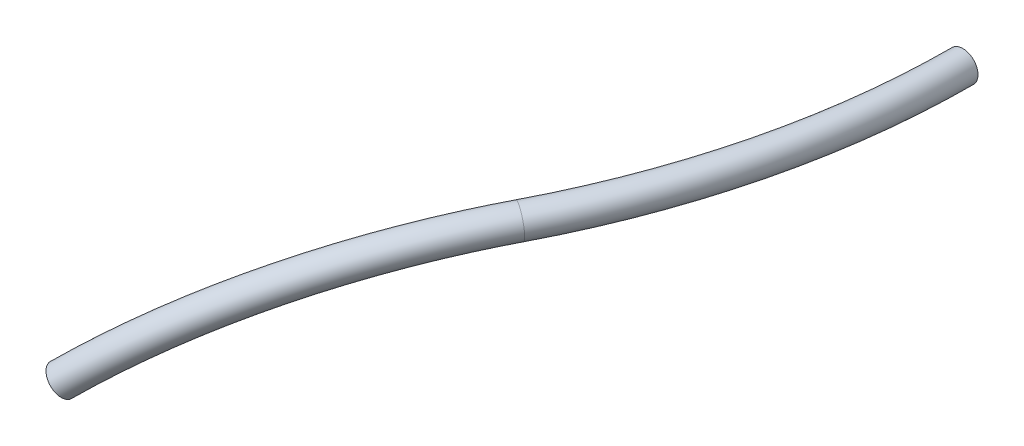
ISO-10303-21;
HEADER;
FILE_DESCRIPTION(('STEP AP214'),'2;1');
FILE_NAME('part.step','',(''),(''),'','','');
FILE_SCHEMA(('AUTOMOTIVE_DESIGN { 1 0 10303 214 1 1 1 1 }'));
ENDSEC;
DATA;
#1=APPLICATION_CONTEXT('core data for automotive mechanical design processes');
#2=APPLICATION_PROTOCOL_DEFINITION('international standard','automotive_design',2000,#1);
#3=PRODUCT_CONTEXT('',#1,'mechanical');
#4=PRODUCT('Part','Part','',(#3));
#5=PRODUCT_RELATED_PRODUCT_CATEGORY('part','',(#4));
#6=PRODUCT_DEFINITION_FORMATION('','',#4);
#7=PRODUCT_DEFINITION_CONTEXT('part definition',#1,'design');
#8=PRODUCT_DEFINITION('design','',#6,#7);
#9=PRODUCT_DEFINITION_SHAPE('','',#8);
#10=(LENGTH_UNIT() NAMED_UNIT(*) SI_UNIT(.MILLI.,.METRE.));
#11=(NAMED_UNIT(*) PLANE_ANGLE_UNIT() SI_UNIT($,.RADIAN.));
#12=(NAMED_UNIT(*) SI_UNIT($,.STERADIAN.) SOLID_ANGLE_UNIT());
#13=UNCERTAINTY_MEASURE_WITH_UNIT(LENGTH_MEASURE(1.E-05),#10,'distance_accuracy_value','');
#14=(GEOMETRIC_REPRESENTATION_CONTEXT(3) GLOBAL_UNCERTAINTY_ASSIGNED_CONTEXT((#13)) GLOBAL_UNIT_ASSIGNED_CONTEXT((#10,
#11,#12)) REPRESENTATION_CONTEXT('',''));
#15=CARTESIAN_POINT('',(0.,0.,0.));
#16=DIRECTION('',(0.,0.,1.));
#17=DIRECTION('',(1.,0.,0.));
#18=AXIS2_PLACEMENT_3D('',#15,#16,#17);
#19=CARTESIAN_POINT('',(1449.22687603527,6635.02328484005,-2.11547757089647E-06));
#20=DIRECTION('',(-0.119729229192261,0.992806583215999,-4.32585094379392E-10));
#21=DIRECTION('',(-0.992806583215999,-0.119729229192262,0.));
#22=AXIS2_PLACEMENT_3D('',#19,#20,#21);
#23=TOROIDAL_SURFACE('',#22,2149.78602138148,50.7999999999995);
#24=CARTESIAN_POINT('',(3249.41686541766,6852.12031458555,1154.88736015426));
#25=DIRECTION('',(-0.533345999528203,-0.0643197845013856,0.843448285379108));
#26=DIRECTION('',(0.845692468035311,-0.0186089838064212,0.53334599954442));
#27=AXIS2_PLACEMENT_3D('',#24,#25,#26);
#28=CIRCLE('',#27,50.7999999999995);
#29=CARTESIAN_POINT('',(3291.95582071417,6857.25037357811,1182.17764738276));
#30=VERTEX_POINT('',#29);
#31=EDGE_CURVE('E10',#30,#30,#28,.T.);
#32=CARTESIAN_POINT('',(3583.54859056854,6892.41550810836,0.));
#33=DIRECTION('',(0.,0.,1.));
#34=DIRECTION('',(1.,0.,0.));
#35=AXIS2_PLACEMENT_3D('',#32,#33,#34);
#36=CIRCLE('',#35,50.7999999999995);
#37=CARTESIAN_POINT('',(3633.98316499591,6898.49775295132,4.99892824368086E-08));
#38=VERTEX_POINT('',#37);
#39=EDGE_CURVE('E41',#38,#38,#36,.T.);
#40=CARTESIAN_POINT('',(1449.22687603527,6635.02328484005,-2.11547757089647E-06));
#41=DIRECTION('',(-0.119729229192261,0.992806583215999,-4.32585094379392E-10));
#42=DIRECTION('',(-0.992806583215999,-0.119729229192262,0.));
#43=AXIS2_PLACEMENT_3D('',#40,#41,#42);
#44=CIRCLE('',#43,2200.58602138148);
#45=EDGE_CURVE('',#30,#38,#44,.T.);
#46=ORIENTED_EDGE('',*,*,#31,.F.);
#47=ORIENTED_EDGE('',*,*,#39,.T.);
#48=ORIENTED_EDGE('',*,*,#45,.T.);
#49=ORIENTED_EDGE('',*,*,#45,.F.);
#50=EDGE_LOOP('',(#46,#48,#47,#49));
#51=FACE_BOUND('',#50,.T.);
#52=ADVANCED_FACE('F35',(#51),#23,.T.);
#53=CARTESIAN_POINT('',(3583.54859056854,6892.41550810836,0.));
#54=DIRECTION('',(0.,0.,1.));
#55=DIRECTION('',(1.,0.,0.));
#56=AXIS2_PLACEMENT_3D('',#53,#54,#55);
#57=PLANE('',#56);
#58=ORIENTED_EDGE('',*,*,#39,.F.);
#59=EDGE_LOOP('',(#58));
#60=FACE_BOUND('',#59,.T.);
#61=ADVANCED_FACE('F56',(#60),#57,.F.);
#62=CARTESIAN_POINT('',(2626.00109106416,5569.72824654101,662.883879267917));
#63=DIRECTION('',(-0.73805584036661,0.5225614180308,-0.426852598547059));
#64=DIRECTION('',(-0.577849341156667,-0.81614345486857,0.));
#65=AXIS2_PLACEMENT_3D('',#62,#63,#64);
#66=TOROIDAL_SURFACE('',#65,1508.39121884895,50.8000000000123);
#67=CARTESIAN_POINT('',(2474.89287595592,6385.37870393067,1922.69525712868));
#68=DIRECTION('',(-0.667261466786293,-0.65918713022834,0.346748413527057));
#69=DIRECTION('',(0.576318448675826,-0.162031732047553,0.801001100826684));
#70=AXIS2_PLACEMENT_3D('',#67,#68,#69);
#71=CIRCLE('',#70,50.8000000000123);
#72=CARTESIAN_POINT('',(2504.16985314866,6377.14749194265,1963.38611305069));
#73=VERTEX_POINT('',#72);
#74=EDGE_CURVE('E45',#73,#73,#71,.T.);
#75=ORIENTED_EDGE('',*,*,#74,.F.);
#76=EDGE_LOOP('',(#75));
#77=FACE_BOUND('',#76,.T.);
#78=ORIENTED_EDGE('',*,*,#31,.T.);
#79=EDGE_LOOP('',(#78));
#80=FACE_BOUND('',#79,.T.);
#81=ADVANCED_FACE('F54',(#77,#80),#66,.T.);
#82=CARTESIAN_POINT('',(2474.89287595592,6385.37870393067,1922.69525712868));
#83=DIRECTION('',(-0.667261466786293,-0.65918713022834,0.346748413527057));
#84=DIRECTION('',(0.576318448675826,-0.162031732047553,0.801001100826684));
#85=AXIS2_PLACEMENT_3D('',#82,#83,#84);
#86=PLANE('',#85);
#87=ORIENTED_EDGE('',*,*,#74,.T.);
#88=EDGE_LOOP('',(#87));
#89=FACE_BOUND('',#88,.T.);
#90=ADVANCED_FACE('F52',(#89),#86,.T.);
#91=CLOSED_SHELL('',(#52,#61,#81,#90));
#92=MANIFOLD_SOLID_BREP('B2',#91);
#93=ADVANCED_BREP_SHAPE_REPRESENTATION('',(#18,#92),#14);
#94=SHAPE_DEFINITION_REPRESENTATION(#9,#93);
ENDSEC;
END-ISO-10303-21;
